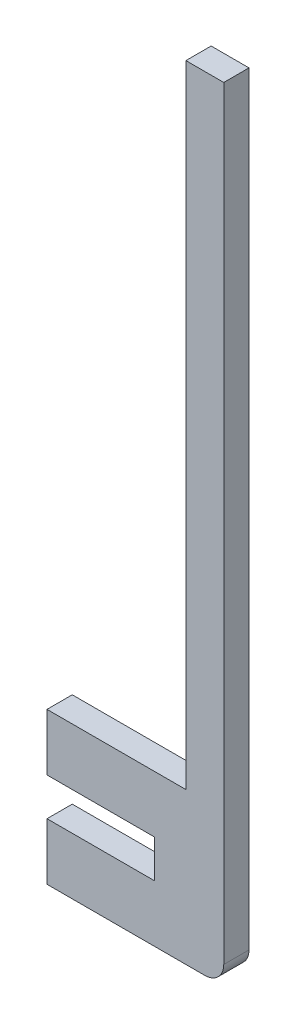
ISO-10303-21;
HEADER;
FILE_DESCRIPTION(('STEP AP214'),'2;1');
FILE_NAME('part.step','',(''),(''),'','','');
FILE_SCHEMA(('AUTOMOTIVE_DESIGN { 1 0 10303 214 1 1 1 1 }'));
ENDSEC;
DATA;
#1=APPLICATION_CONTEXT('core data for automotive mechanical design processes');
#2=APPLICATION_PROTOCOL_DEFINITION('international standard','automotive_design',2000,#1);
#3=PRODUCT_CONTEXT('',#1,'mechanical');
#4=PRODUCT('Part','Part','',(#3));
#5=PRODUCT_RELATED_PRODUCT_CATEGORY('part','',(#4));
#6=PRODUCT_DEFINITION_FORMATION('','',#4);
#7=PRODUCT_DEFINITION_CONTEXT('part definition',#1,'design');
#8=PRODUCT_DEFINITION('design','',#6,#7);
#9=PRODUCT_DEFINITION_SHAPE('','',#8);
#10=(LENGTH_UNIT() NAMED_UNIT(*) SI_UNIT(.MILLI.,.METRE.));
#11=(NAMED_UNIT(*) PLANE_ANGLE_UNIT() SI_UNIT($,.RADIAN.));
#12=(NAMED_UNIT(*) SI_UNIT($,.STERADIAN.) SOLID_ANGLE_UNIT());
#13=UNCERTAINTY_MEASURE_WITH_UNIT(LENGTH_MEASURE(1.E-05),#10,'distance_accuracy_value','');
#14=(GEOMETRIC_REPRESENTATION_CONTEXT(3) GLOBAL_UNCERTAINTY_ASSIGNED_CONTEXT((#13)) GLOBAL_UNIT_ASSIGNED_CONTEXT((#10,
#11,#12)) REPRESENTATION_CONTEXT('',''));
#15=CARTESIAN_POINT('',(0.,0.,0.));
#16=DIRECTION('',(0.,0.,1.));
#17=DIRECTION('',(1.,0.,0.));
#18=AXIS2_PLACEMENT_3D('',#15,#16,#17);
#19=CARTESIAN_POINT('',(11.,0.,2.));
#20=DIRECTION('',(0.,1.,0.));
#21=DIRECTION('',(-1.,0.,0.));
#22=AXIS2_PLACEMENT_3D('',#19,#20,#21);
#23=PLANE('',#22);
#24=DIRECTION('',(1.,0.,0.));
#25=VECTOR('',#24,1.);
#26=CARTESIAN_POINT('',(11.,0.,0.));
#27=LINE('',#26,#25);
#28=CARTESIAN_POINT('',(0.,0.,0.));
#29=VERTEX_POINT('',#28);
#30=CARTESIAN_POINT('',(12.5,0.,0.));
#31=VERTEX_POINT('',#30);
#32=EDGE_CURVE('E96',#29,#31,#27,.T.);
#33=ORIENTED_EDGE('',*,*,#32,.T.);
#34=DIRECTION('',(0.,0.,-1.));
#35=VECTOR('',#34,1.);
#36=CARTESIAN_POINT('',(12.5,0.,2.));
#37=LINE('',#36,#35);
#38=CARTESIAN_POINT('',(12.5,0.,2.));
#39=VERTEX_POINT('',#38);
#40=EDGE_CURVE('E11',#39,#31,#37,.T.);
#41=ORIENTED_EDGE('',*,*,#40,.F.);
#42=DIRECTION('',(1.,0.,0.));
#43=VECTOR('',#42,1.);
#44=CARTESIAN_POINT('',(11.,0.,2.));
#45=LINE('',#44,#43);
#46=CARTESIAN_POINT('',(0.,0.,2.));
#47=VERTEX_POINT('',#46);
#48=EDGE_CURVE('E102',#47,#39,#45,.T.);
#49=ORIENTED_EDGE('',*,*,#48,.F.);
#50=DIRECTION('',(0.,0.,-1.));
#51=VECTOR('',#50,1.);
#52=CARTESIAN_POINT('',(0.,0.,2.));
#53=LINE('',#52,#51);
#54=EDGE_CURVE('E145',#47,#29,#53,.T.);
#55=ORIENTED_EDGE('',*,*,#54,.T.);
#56=EDGE_LOOP('',(#33,#41,#49,#55));
#57=FACE_BOUND('',#56,.T.);
#58=ADVANCED_FACE('F35',(#57),#23,.F.);
#59=CARTESIAN_POINT('',(12.5,1.5,2.));
#60=DIRECTION('',(0.,0.,-1.));
#61=DIRECTION('',(-1.,0.,0.));
#62=AXIS2_PLACEMENT_3D('',#59,#60,#61);
#63=CYLINDRICAL_SURFACE('',#62,1.5);
#64=CARTESIAN_POINT('',(12.5,1.5,0.));
#65=DIRECTION('',(0.,0.,1.));
#66=DIRECTION('',(1.,0.,0.));
#67=AXIS2_PLACEMENT_3D('',#64,#65,#66);
#68=CIRCLE('',#67,1.5);
#69=CARTESIAN_POINT('',(14.,1.50000000000001,0.));
#70=VERTEX_POINT('',#69);
#71=EDGE_CURVE('E150',#31,#70,#68,.T.);
#72=ORIENTED_EDGE('',*,*,#71,.T.);
#73=DIRECTION('',(0.,0.,-1.));
#74=VECTOR('',#73,1.);
#75=CARTESIAN_POINT('',(14.,1.50000000000001,2.));
#76=LINE('',#75,#74);
#77=CARTESIAN_POINT('',(14.,1.50000000000001,2.));
#78=VERTEX_POINT('',#77);
#79=EDGE_CURVE('E43',#78,#70,#76,.T.);
#80=ORIENTED_EDGE('',*,*,#79,.F.);
#81=CARTESIAN_POINT('',(12.5,1.5,2.));
#82=DIRECTION('',(0.,0.,1.));
#83=DIRECTION('',(1.,0.,0.));
#84=AXIS2_PLACEMENT_3D('',#81,#82,#83);
#85=CIRCLE('',#84,1.5);
#86=EDGE_CURVE('E230',#39,#78,#85,.T.);
#87=ORIENTED_EDGE('',*,*,#86,.F.);
#88=ORIENTED_EDGE('',*,*,#40,.T.);
#89=EDGE_LOOP('',(#72,#80,#87,#88));
#90=FACE_BOUND('',#89,.T.);
#91=ADVANCED_FACE('F233',(#90),#63,.T.);
#92=CARTESIAN_POINT('',(14.,1.50000000000001,2.));
#93=DIRECTION('',(-1.,0.,0.));
#94=DIRECTION('',(0.,-1.,0.));
#95=AXIS2_PLACEMENT_3D('',#92,#93,#94);
#96=PLANE('',#95);
#97=DIRECTION('',(0.,1.,0.));
#98=VECTOR('',#97,1.);
#99=CARTESIAN_POINT('',(14.,1.50000000000001,0.));
#100=LINE('',#99,#98);
#101=CARTESIAN_POINT('',(14.,62.,0.));
#102=VERTEX_POINT('',#101);
#103=EDGE_CURVE('E152',#70,#102,#100,.T.);
#104=ORIENTED_EDGE('',*,*,#103,.T.);
#105=DIRECTION('',(0.,0.,-1.));
#106=VECTOR('',#105,1.);
#107=CARTESIAN_POINT('',(14.,62.,2.));
#108=LINE('',#107,#106);
#109=CARTESIAN_POINT('',(14.,62.,2.));
#110=VERTEX_POINT('',#109);
#111=EDGE_CURVE('E184',#110,#102,#108,.T.);
#112=ORIENTED_EDGE('',*,*,#111,.F.);
#113=DIRECTION('',(0.,1.,0.));
#114=VECTOR('',#113,1.);
#115=CARTESIAN_POINT('',(14.,1.50000000000001,2.));
#116=LINE('',#115,#114);
#117=EDGE_CURVE('E193',#78,#110,#116,.T.);
#118=ORIENTED_EDGE('',*,*,#117,.F.);
#119=ORIENTED_EDGE('',*,*,#79,.T.);
#120=EDGE_LOOP('',(#104,#112,#118,#119));
#121=FACE_BOUND('',#120,.T.);
#122=ADVANCED_FACE('F191',(#121),#96,.F.);
#123=CARTESIAN_POINT('',(14.,62.,2.));
#124=DIRECTION('',(0.,-1.,0.));
#125=DIRECTION('',(0.,0.,-1.));
#126=AXIS2_PLACEMENT_3D('',#123,#124,#125);
#127=PLANE('',#126);
#128=DIRECTION('',(-1.,0.,0.));
#129=VECTOR('',#128,1.);
#130=CARTESIAN_POINT('',(14.,62.,0.));
#131=LINE('',#130,#129);
#132=CARTESIAN_POINT('',(11.,62.,0.));
#133=VERTEX_POINT('',#132);
#134=EDGE_CURVE('E154',#102,#133,#131,.T.);
#135=ORIENTED_EDGE('',*,*,#134,.T.);
#136=DIRECTION('',(0.,0.,-1.));
#137=VECTOR('',#136,1.);
#138=CARTESIAN_POINT('',(11.,62.,2.));
#139=LINE('',#138,#137);
#140=CARTESIAN_POINT('',(11.,62.,2.));
#141=VERTEX_POINT('',#140);
#142=EDGE_CURVE('E181',#141,#133,#139,.T.);
#143=ORIENTED_EDGE('',*,*,#142,.F.);
#144=DIRECTION('',(-1.,0.,0.));
#145=VECTOR('',#144,1.);
#146=CARTESIAN_POINT('',(14.,62.,2.));
#147=LINE('',#146,#145);
#148=EDGE_CURVE('E211',#110,#141,#147,.T.);
#149=ORIENTED_EDGE('',*,*,#148,.F.);
#150=ORIENTED_EDGE('',*,*,#111,.T.);
#151=EDGE_LOOP('',(#135,#143,#149,#150));
#152=FACE_BOUND('',#151,.T.);
#153=ADVANCED_FACE('F202',(#152),#127,.F.);
#154=CARTESIAN_POINT('',(11.,62.,2.));
#155=DIRECTION('',(1.,0.,0.));
#156=DIRECTION('',(0.,1.,0.));
#157=AXIS2_PLACEMENT_3D('',#154,#155,#156);
#158=PLANE('',#157);
#159=DIRECTION('',(0.,-1.,0.));
#160=VECTOR('',#159,1.);
#161=CARTESIAN_POINT('',(11.,62.,0.));
#162=LINE('',#161,#160);
#163=CARTESIAN_POINT('',(11.,12.,0.));
#164=VERTEX_POINT('',#163);
#165=EDGE_CURVE('E156',#133,#164,#162,.T.);
#166=ORIENTED_EDGE('',*,*,#165,.T.);
#167=DIRECTION('',(0.,0.,-1.));
#168=VECTOR('',#167,1.);
#169=CARTESIAN_POINT('',(11.,12.,2.));
#170=LINE('',#169,#168);
#171=CARTESIAN_POINT('',(11.,12.,2.));
#172=VERTEX_POINT('',#171);
#173=EDGE_CURVE('E178',#172,#164,#170,.T.);
#174=ORIENTED_EDGE('',*,*,#173,.F.);
#175=DIRECTION('',(0.,-1.,0.));
#176=VECTOR('',#175,1.);
#177=CARTESIAN_POINT('',(11.,62.,2.));
#178=LINE('',#177,#176);
#179=EDGE_CURVE('E208',#141,#172,#178,.T.);
#180=ORIENTED_EDGE('',*,*,#179,.F.);
#181=ORIENTED_EDGE('',*,*,#142,.T.);
#182=EDGE_LOOP('',(#166,#174,#180,#181));
#183=FACE_BOUND('',#182,.T.);
#184=ADVANCED_FACE('F206',(#183),#158,.F.);
#185=CARTESIAN_POINT('',(0.,12.,2.));
#186=DIRECTION('',(0.,-1.,0.));
#187=DIRECTION('',(0.,0.,-1.));
#188=AXIS2_PLACEMENT_3D('',#185,#186,#187);
#189=PLANE('',#188);
#190=DIRECTION('',(-1.,0.,0.));
#191=VECTOR('',#190,1.);
#192=CARTESIAN_POINT('',(0.,12.,0.));
#193=LINE('',#192,#191);
#194=CARTESIAN_POINT('',(0.,12.,0.));
#195=VERTEX_POINT('',#194);
#196=EDGE_CURVE('E158',#164,#195,#193,.T.);
#197=ORIENTED_EDGE('',*,*,#196,.T.);
#198=DIRECTION('',(0.,0.,-1.));
#199=VECTOR('',#198,1.);
#200=CARTESIAN_POINT('',(0.,12.,2.));
#201=LINE('',#200,#199);
#202=CARTESIAN_POINT('',(0.,12.,2.));
#203=VERTEX_POINT('',#202);
#204=EDGE_CURVE('E175',#203,#195,#201,.T.);
#205=ORIENTED_EDGE('',*,*,#204,.F.);
#206=DIRECTION('',(-1.,0.,0.));
#207=VECTOR('',#206,1.);
#208=CARTESIAN_POINT('',(0.,12.,2.));
#209=LINE('',#208,#207);
#210=EDGE_CURVE('E210',#172,#203,#209,.T.);
#211=ORIENTED_EDGE('',*,*,#210,.F.);
#212=ORIENTED_EDGE('',*,*,#173,.T.);
#213=EDGE_LOOP('',(#197,#205,#211,#212));
#214=FACE_BOUND('',#213,.T.);
#215=ADVANCED_FACE('F245',(#214),#189,.F.);
#216=CARTESIAN_POINT('',(0.,7.5,2.));
#217=DIRECTION('',(1.,0.,0.));
#218=DIRECTION('',(0.,0.,-1.));
#219=AXIS2_PLACEMENT_3D('',#216,#217,#218);
#220=PLANE('',#219);
#221=DIRECTION('',(0.,-1.,0.));
#222=VECTOR('',#221,1.);
#223=CARTESIAN_POINT('',(0.,7.5,0.));
#224=LINE('',#223,#222);
#225=CARTESIAN_POINT('',(0.,7.5,0.));
#226=VERTEX_POINT('',#225);
#227=EDGE_CURVE('E160',#195,#226,#224,.T.);
#228=ORIENTED_EDGE('',*,*,#227,.T.);
#229=DIRECTION('',(0.,0.,-1.));
#230=VECTOR('',#229,1.);
#231=CARTESIAN_POINT('',(0.,7.5,2.));
#232=LINE('',#231,#230);
#233=CARTESIAN_POINT('',(0.,7.5,2.));
#234=VERTEX_POINT('',#233);
#235=EDGE_CURVE('E172',#234,#226,#232,.T.);
#236=ORIENTED_EDGE('',*,*,#235,.F.);
#237=DIRECTION('',(0.,-1.,0.));
#238=VECTOR('',#237,1.);
#239=CARTESIAN_POINT('',(0.,7.5,2.));
#240=LINE('',#239,#238);
#241=EDGE_CURVE('E213',#203,#234,#240,.T.);
#242=ORIENTED_EDGE('',*,*,#241,.F.);
#243=ORIENTED_EDGE('',*,*,#204,.T.);
#244=EDGE_LOOP('',(#228,#236,#242,#243));
#245=FACE_BOUND('',#244,.T.);
#246=ADVANCED_FACE('F222',(#245),#220,.F.);
#247=CARTESIAN_POINT('',(8.5,7.5,2.));
#248=DIRECTION('',(0.,1.,0.));
#249=DIRECTION('',(0.,0.,1.));
#250=AXIS2_PLACEMENT_3D('',#247,#248,#249);
#251=PLANE('',#250);
#252=DIRECTION('',(1.,0.,0.));
#253=VECTOR('',#252,1.);
#254=CARTESIAN_POINT('',(8.5,7.5,0.));
#255=LINE('',#254,#253);
#256=CARTESIAN_POINT('',(8.5,7.5,0.));
#257=VERTEX_POINT('',#256);
#258=EDGE_CURVE('E162',#226,#257,#255,.T.);
#259=ORIENTED_EDGE('',*,*,#258,.T.);
#260=DIRECTION('',(0.,0.,-1.));
#261=VECTOR('',#260,1.);
#262=CARTESIAN_POINT('',(8.5,7.5,2.));
#263=LINE('',#262,#261);
#264=CARTESIAN_POINT('',(8.5,7.5,2.));
#265=VERTEX_POINT('',#264);
#266=EDGE_CURVE('E140',#265,#257,#263,.T.);
#267=ORIENTED_EDGE('',*,*,#266,.F.);
#268=DIRECTION('',(1.,0.,0.));
#269=VECTOR('',#268,1.);
#270=CARTESIAN_POINT('',(8.5,7.5,2.));
#271=LINE('',#270,#269);
#272=EDGE_CURVE('E131',#234,#265,#271,.T.);
#273=ORIENTED_EDGE('',*,*,#272,.F.);
#274=ORIENTED_EDGE('',*,*,#235,.T.);
#275=EDGE_LOOP('',(#259,#267,#273,#274));
#276=FACE_BOUND('',#275,.T.);
#277=ADVANCED_FACE('F226',(#276),#251,.F.);
#278=CARTESIAN_POINT('',(8.5,4.5,2.));
#279=DIRECTION('',(1.,0.,0.));
#280=DIRECTION('',(0.,0.,-1.));
#281=AXIS2_PLACEMENT_3D('',#278,#279,#280);
#282=PLANE('',#281);
#283=DIRECTION('',(0.,-1.,0.));
#284=VECTOR('',#283,1.);
#285=CARTESIAN_POINT('',(8.5,4.5,0.));
#286=LINE('',#285,#284);
#287=CARTESIAN_POINT('',(8.5,4.5,0.));
#288=VERTEX_POINT('',#287);
#289=EDGE_CURVE('E139',#257,#288,#286,.T.);
#290=ORIENTED_EDGE('',*,*,#289,.T.);
#291=DIRECTION('',(0.,0.,-1.));
#292=VECTOR('',#291,1.);
#293=CARTESIAN_POINT('',(8.5,4.5,2.));
#294=LINE('',#293,#292);
#295=CARTESIAN_POINT('',(8.5,4.5,2.));
#296=VERTEX_POINT('',#295);
#297=EDGE_CURVE('E136',#296,#288,#294,.T.);
#298=ORIENTED_EDGE('',*,*,#297,.F.);
#299=DIRECTION('',(0.,-1.,0.));
#300=VECTOR('',#299,1.);
#301=CARTESIAN_POINT('',(8.5,4.5,2.));
#302=LINE('',#301,#300);
#303=EDGE_CURVE('E125',#265,#296,#302,.T.);
#304=ORIENTED_EDGE('',*,*,#303,.F.);
#305=ORIENTED_EDGE('',*,*,#266,.T.);
#306=EDGE_LOOP('',(#290,#298,#304,#305));
#307=FACE_BOUND('',#306,.T.);
#308=ADVANCED_FACE('F137',(#307),#282,.F.);
#309=CARTESIAN_POINT('',(0.,4.5,2.));
#310=DIRECTION('',(0.,-1.,0.));
#311=DIRECTION('',(1.,0.,0.));
#312=AXIS2_PLACEMENT_3D('',#309,#310,#311);
#313=PLANE('',#312);
#314=DIRECTION('',(-1.,0.,0.));
#315=VECTOR('',#314,1.);
#316=CARTESIAN_POINT('',(0.,4.5,0.));
#317=LINE('',#316,#315);
#318=CARTESIAN_POINT('',(0.,4.5,0.));
#319=VERTEX_POINT('',#318);
#320=EDGE_CURVE('E89',#288,#319,#317,.T.);
#321=ORIENTED_EDGE('',*,*,#320,.T.);
#322=DIRECTION('',(0.,0.,-1.));
#323=VECTOR('',#322,1.);
#324=CARTESIAN_POINT('',(0.,4.5,2.));
#325=LINE('',#324,#323);
#326=CARTESIAN_POINT('',(0.,4.5,2.));
#327=VERTEX_POINT('',#326);
#328=EDGE_CURVE('E141',#327,#319,#325,.T.);
#329=ORIENTED_EDGE('',*,*,#328,.F.);
#330=DIRECTION('',(-1.,0.,0.));
#331=VECTOR('',#330,1.);
#332=CARTESIAN_POINT('',(0.,4.5,2.));
#333=LINE('',#332,#331);
#334=EDGE_CURVE('E129',#296,#327,#333,.T.);
#335=ORIENTED_EDGE('',*,*,#334,.F.);
#336=ORIENTED_EDGE('',*,*,#297,.T.);
#337=EDGE_LOOP('',(#321,#329,#335,#336));
#338=FACE_BOUND('',#337,.T.);
#339=ADVANCED_FACE('F143',(#338),#313,.F.);
#340=CARTESIAN_POINT('',(0.,0.,2.));
#341=DIRECTION('',(1.,0.,0.));
#342=DIRECTION('',(0.,0.,-1.));
#343=AXIS2_PLACEMENT_3D('',#340,#341,#342);
#344=PLANE('',#343);
#345=DIRECTION('',(0.,-1.,0.));
#346=VECTOR('',#345,1.);
#347=CARTESIAN_POINT('',(0.,0.,0.));
#348=LINE('',#347,#346);
#349=EDGE_CURVE('E166',#319,#29,#348,.T.);
#350=ORIENTED_EDGE('',*,*,#349,.T.);
#351=ORIENTED_EDGE('',*,*,#54,.F.);
#352=DIRECTION('',(0.,-1.,0.));
#353=VECTOR('',#352,1.);
#354=CARTESIAN_POINT('',(0.,0.,2.));
#355=LINE('',#354,#353);
#356=EDGE_CURVE('E51',#327,#47,#355,.T.);
#357=ORIENTED_EDGE('',*,*,#356,.F.);
#358=ORIENTED_EDGE('',*,*,#328,.T.);
#359=EDGE_LOOP('',(#350,#351,#357,#358));
#360=FACE_BOUND('',#359,.T.);
#361=ADVANCED_FACE('F228',(#360),#344,.F.);
#362=CARTESIAN_POINT('',(12.5,1.5,2.));
#363=DIRECTION('',(0.,0.,1.));
#364=DIRECTION('',(1.,0.,0.));
#365=AXIS2_PLACEMENT_3D('',#362,#363,#364);
#366=PLANE('',#365);
#367=ORIENTED_EDGE('',*,*,#48,.T.);
#368=ORIENTED_EDGE('',*,*,#86,.T.);
#369=ORIENTED_EDGE('',*,*,#117,.T.);
#370=ORIENTED_EDGE('',*,*,#148,.T.);
#371=ORIENTED_EDGE('',*,*,#179,.T.);
#372=ORIENTED_EDGE('',*,*,#210,.T.);
#373=ORIENTED_EDGE('',*,*,#241,.T.);
#374=ORIENTED_EDGE('',*,*,#272,.T.);
#375=ORIENTED_EDGE('',*,*,#303,.T.);
#376=ORIENTED_EDGE('',*,*,#334,.T.);
#377=ORIENTED_EDGE('',*,*,#356,.T.);
#378=EDGE_LOOP('',(#367,#368,#369,#370,#371,#372,#373,#374,#375,#376,#377));
#379=FACE_BOUND('',#378,.T.);
#380=ADVANCED_FACE('F127',(#379),#366,.T.);
#381=CARTESIAN_POINT('',(12.5,1.5,0.));
#382=DIRECTION('',(0.,0.,1.));
#383=DIRECTION('',(1.,0.,0.));
#384=AXIS2_PLACEMENT_3D('',#381,#382,#383);
#385=PLANE('',#384);
#386=ORIENTED_EDGE('',*,*,#32,.F.);
#387=ORIENTED_EDGE('',*,*,#349,.F.);
#388=ORIENTED_EDGE('',*,*,#320,.F.);
#389=ORIENTED_EDGE('',*,*,#289,.F.);
#390=ORIENTED_EDGE('',*,*,#258,.F.);
#391=ORIENTED_EDGE('',*,*,#227,.F.);
#392=ORIENTED_EDGE('',*,*,#196,.F.);
#393=ORIENTED_EDGE('',*,*,#165,.F.);
#394=ORIENTED_EDGE('',*,*,#134,.F.);
#395=ORIENTED_EDGE('',*,*,#103,.F.);
#396=ORIENTED_EDGE('',*,*,#71,.F.);
#397=EDGE_LOOP('',(#386,#387,#388,#389,#390,#391,#392,#393,#394,#395,#396));
#398=FACE_BOUND('',#397,.T.);
#399=ADVANCED_FACE('F197',(#398),#385,.F.);
#400=CLOSED_SHELL('',(#58,#91,#122,#153,#184,#215,#246,#277,#308,#339,#361,#380,#399));
#401=MANIFOLD_SOLID_BREP('B2',#400);
#402=ADVANCED_BREP_SHAPE_REPRESENTATION('',(#18,#401),#14);
#403=SHAPE_DEFINITION_REPRESENTATION(#9,#402);
ENDSEC;
END-ISO-10303-21;
